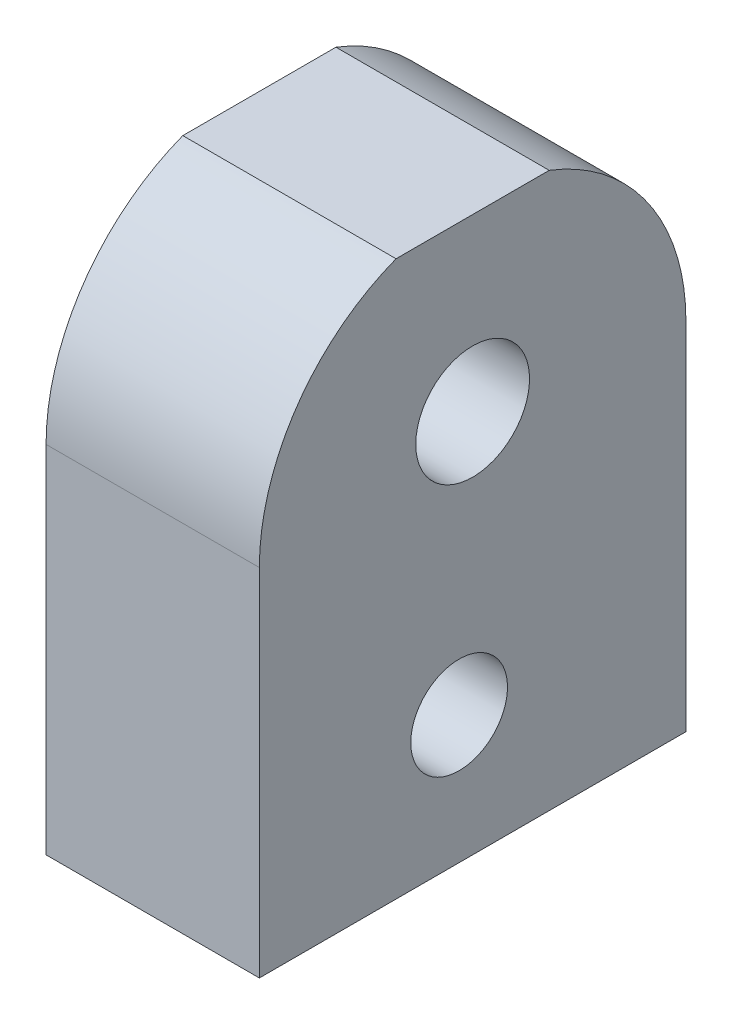
ISO-10303-21;
HEADER;
FILE_DESCRIPTION(('STEP AP214'),'2;1');
FILE_NAME('part.step','',(''),(''),'','','');
FILE_SCHEMA(('AUTOMOTIVE_DESIGN { 1 0 10303 214 1 1 1 1 }'));
ENDSEC;
DATA;
#1=APPLICATION_CONTEXT('core data for automotive mechanical design processes');
#2=APPLICATION_PROTOCOL_DEFINITION('international standard','automotive_design',2000,#1);
#3=PRODUCT_CONTEXT('',#1,'mechanical');
#4=PRODUCT('Part','Part','',(#3));
#5=PRODUCT_RELATED_PRODUCT_CATEGORY('part','',(#4));
#6=PRODUCT_DEFINITION_FORMATION('','',#4);
#7=PRODUCT_DEFINITION_CONTEXT('part definition',#1,'design');
#8=PRODUCT_DEFINITION('design','',#6,#7);
#9=PRODUCT_DEFINITION_SHAPE('','',#8);
#10=(LENGTH_UNIT() NAMED_UNIT(*) SI_UNIT(.MILLI.,.METRE.));
#11=(NAMED_UNIT(*) PLANE_ANGLE_UNIT() SI_UNIT($,.RADIAN.));
#12=(NAMED_UNIT(*) SI_UNIT($,.STERADIAN.) SOLID_ANGLE_UNIT());
#13=UNCERTAINTY_MEASURE_WITH_UNIT(LENGTH_MEASURE(1.E-05),#10,'distance_accuracy_value','');
#14=(GEOMETRIC_REPRESENTATION_CONTEXT(3) GLOBAL_UNCERTAINTY_ASSIGNED_CONTEXT((#13)) GLOBAL_UNIT_ASSIGNED_CONTEXT((#10,
#11,#12)) REPRESENTATION_CONTEXT('',''));
#15=CARTESIAN_POINT('',(0.,0.,0.));
#16=DIRECTION('',(0.,0.,1.));
#17=DIRECTION('',(1.,0.,0.));
#18=AXIS2_PLACEMENT_3D('',#15,#16,#17);
#19=CARTESIAN_POINT('',(15.,25.,15.));
#20=DIRECTION('',(-1.,0.,0.));
#21=DIRECTION('',(0.,0.,1.));
#22=AXIS2_PLACEMENT_3D('',#19,#20,#21);
#23=CYLINDRICAL_SURFACE('',#22,15.);
#24=DIRECTION('',(-1.,0.,0.));
#25=VECTOR('',#24,1.);
#26=CARTESIAN_POINT('',(15.,39.,20.3851648071345));
#27=LINE('',#26,#25);
#28=CARTESIAN_POINT('',(15.,39.,20.3851648071345));
#29=VERTEX_POINT('',#28);
#30=CARTESIAN_POINT('',(0.,39.,20.3851648071345));
#31=VERTEX_POINT('',#30);
#32=EDGE_CURVE('E80',#29,#31,#27,.T.);
#33=ORIENTED_EDGE('',*,*,#32,.T.);
#34=CARTESIAN_POINT('',(0.,25.,15.));
#35=DIRECTION('',(-1.,0.,0.));
#36=DIRECTION('',(0.,0.,1.));
#37=AXIS2_PLACEMENT_3D('',#34,#35,#36);
#38=CIRCLE('',#37,15.);
#39=CARTESIAN_POINT('',(0.,25.,30.));
#40=VERTEX_POINT('',#39);
#41=EDGE_CURVE('E154',#40,#31,#38,.T.);
#42=ORIENTED_EDGE('',*,*,#41,.F.);
#43=DIRECTION('',(1.,0.,0.));
#44=VECTOR('',#43,1.);
#45=CARTESIAN_POINT('',(15.,25.,30.));
#46=LINE('',#45,#44);
#47=CARTESIAN_POINT('',(15.,25.,30.));
#48=VERTEX_POINT('',#47);
#49=EDGE_CURVE('E124',#40,#48,#46,.T.);
#50=ORIENTED_EDGE('',*,*,#49,.T.);
#51=CARTESIAN_POINT('',(15.,25.,15.));
#52=DIRECTION('',(-1.,0.,0.));
#53=DIRECTION('',(0.,0.,1.));
#54=AXIS2_PLACEMENT_3D('',#51,#52,#53);
#55=CIRCLE('',#54,15.);
#56=EDGE_CURVE('E129',#48,#29,#55,.T.);
#57=ORIENTED_EDGE('',*,*,#56,.T.);
#58=EDGE_LOOP('',(#33,#42,#50,#57));
#59=FACE_BOUND('',#58,.T.);
#60=ADVANCED_FACE('F45',(#59),#23,.T.);
#61=CARTESIAN_POINT('',(0.,25.,0.));
#62=DIRECTION('',(0.,0.,1.));
#63=DIRECTION('',(1.,0.,0.));
#64=AXIS2_PLACEMENT_3D('',#61,#62,#63);
#65=PLANE('',#64);
#66=DIRECTION('',(-1.,0.,0.));
#67=VECTOR('',#66,1.);
#68=CARTESIAN_POINT('',(0.,0.,0.));
#69=LINE('',#68,#67);
#70=CARTESIAN_POINT('',(15.,0.,0.));
#71=VERTEX_POINT('',#70);
#72=CARTESIAN_POINT('',(0.,0.,0.));
#73=VERTEX_POINT('',#72);
#74=EDGE_CURVE('E121',#71,#73,#69,.T.);
#75=ORIENTED_EDGE('',*,*,#74,.T.);
#76=DIRECTION('',(0.,-1.,0.));
#77=VECTOR('',#76,1.);
#78=CARTESIAN_POINT('',(0.,25.,0.));
#79=LINE('',#78,#77);
#80=CARTESIAN_POINT('',(0.,25.,0.));
#81=VERTEX_POINT('',#80);
#82=EDGE_CURVE('E11',#81,#73,#79,.T.);
#83=ORIENTED_EDGE('',*,*,#82,.F.);
#84=DIRECTION('',(-1.,0.,0.));
#85=VECTOR('',#84,1.);
#86=CARTESIAN_POINT('',(0.,25.,0.));
#87=LINE('',#86,#85);
#88=CARTESIAN_POINT('',(15.,25.,0.));
#89=VERTEX_POINT('',#88);
#90=EDGE_CURVE('E116',#89,#81,#87,.T.);
#91=ORIENTED_EDGE('',*,*,#90,.F.);
#92=DIRECTION('',(0.,-1.,0.));
#93=VECTOR('',#92,1.);
#94=CARTESIAN_POINT('',(15.,25.,0.));
#95=LINE('',#94,#93);
#96=EDGE_CURVE('E109',#89,#71,#95,.T.);
#97=ORIENTED_EDGE('',*,*,#96,.T.);
#98=EDGE_LOOP('',(#75,#83,#91,#97));
#99=FACE_BOUND('',#98,.T.);
#100=ADVANCED_FACE('F47',(#99),#65,.F.);
#101=CARTESIAN_POINT('',(0.,25.,0.));
#102=DIRECTION('',(1.,0.,0.));
#103=DIRECTION('',(0.,0.,-1.));
#104=AXIS2_PLACEMENT_3D('',#101,#102,#103);
#105=PLANE('',#104);
#106=CARTESIAN_POINT('',(0.,9.,15.95));
#107=DIRECTION('',(-1.,0.,0.));
#108=DIRECTION('',(0.,0.,1.));
#109=AXIS2_PLACEMENT_3D('',#106,#107,#108);
#110=CIRCLE('',#109,3.4);
#111=CARTESIAN_POINT('',(0.,9.,19.35));
#112=VERTEX_POINT('',#111);
#113=EDGE_CURVE('E172',#112,#112,#110,.T.);
#114=ORIENTED_EDGE('',*,*,#113,.F.);
#115=EDGE_LOOP('',(#114));
#116=FACE_BOUND('',#115,.T.);
#117=CARTESIAN_POINT('',(0.,27.,15.));
#118=DIRECTION('',(-1.,0.,0.));
#119=DIRECTION('',(0.,0.,1.));
#120=AXIS2_PLACEMENT_3D('',#117,#118,#119);
#121=CIRCLE('',#120,6.1);
#122=CARTESIAN_POINT('',(0.,27.,21.1));
#123=VERTEX_POINT('',#122);
#124=EDGE_CURVE('E193',#123,#123,#121,.T.);
#125=ORIENTED_EDGE('',*,*,#124,.F.);
#126=EDGE_LOOP('',(#125));
#127=FACE_BOUND('',#126,.T.);
#128=ORIENTED_EDGE('',*,*,#41,.T.);
#129=DIRECTION('',(0.,0.,-1.));
#130=VECTOR('',#129,1.);
#131=CARTESIAN_POINT('',(0.,39.,0.));
#132=LINE('',#131,#130);
#133=CARTESIAN_POINT('',(0.,39.,9.6148351928655));
#134=VERTEX_POINT('',#133);
#135=EDGE_CURVE('E49',#134,#31,#132,.F.);
#136=ORIENTED_EDGE('',*,*,#135,.F.);
#137=EDGE_CURVE('E157',#134,#81,#38,.T.);
#138=ORIENTED_EDGE('',*,*,#137,.T.);
#139=ORIENTED_EDGE('',*,*,#82,.T.);
#140=DIRECTION('',(0.,0.,1.));
#141=VECTOR('',#140,1.);
#142=CARTESIAN_POINT('',(0.,0.,0.));
#143=LINE('',#142,#141);
#144=CARTESIAN_POINT('',(0.,0.,30.));
#145=VERTEX_POINT('',#144);
#146=EDGE_CURVE('E127',#73,#145,#143,.T.);
#147=ORIENTED_EDGE('',*,*,#146,.T.);
#148=DIRECTION('',(0.,-1.,0.));
#149=VECTOR('',#148,1.);
#150=CARTESIAN_POINT('',(0.,25.,30.));
#151=LINE('',#150,#149);
#152=EDGE_CURVE('E56',#40,#145,#151,.T.);
#153=ORIENTED_EDGE('',*,*,#152,.F.);
#154=EDGE_LOOP('',(#128,#136,#138,#139,#147,#153));
#155=FACE_BOUND('',#154,.T.);
#156=ADVANCED_FACE('F153',(#116,#127,#155),#105,.F.);
#157=CARTESIAN_POINT('',(15.,25.,30.));
#158=DIRECTION('',(0.,0.,-1.));
#159=DIRECTION('',(-1.,0.,0.));
#160=AXIS2_PLACEMENT_3D('',#157,#158,#159);
#161=PLANE('',#160);
#162=DIRECTION('',(1.,0.,0.));
#163=VECTOR('',#162,1.);
#164=CARTESIAN_POINT('',(15.,0.,30.));
#165=LINE('',#164,#163);
#166=CARTESIAN_POINT('',(15.,0.,30.));
#167=VERTEX_POINT('',#166);
#168=EDGE_CURVE('E99',#145,#167,#165,.T.);
#169=ORIENTED_EDGE('',*,*,#168,.T.);
#170=DIRECTION('',(0.,-1.,0.));
#171=VECTOR('',#170,1.);
#172=CARTESIAN_POINT('',(15.,25.,30.));
#173=LINE('',#172,#171);
#174=EDGE_CURVE('E112',#48,#167,#173,.T.);
#175=ORIENTED_EDGE('',*,*,#174,.F.);
#176=ORIENTED_EDGE('',*,*,#49,.F.);
#177=ORIENTED_EDGE('',*,*,#152,.T.);
#178=EDGE_LOOP('',(#169,#175,#176,#177));
#179=FACE_BOUND('',#178,.T.);
#180=ADVANCED_FACE('F148',(#179),#161,.F.);
#181=CARTESIAN_POINT('',(15.,25.,0.));
#182=DIRECTION('',(-1.,0.,0.));
#183=DIRECTION('',(0.,0.,1.));
#184=AXIS2_PLACEMENT_3D('',#181,#182,#183);
#185=PLANE('',#184);
#186=CARTESIAN_POINT('',(15.,9.,15.95));
#187=DIRECTION('',(-1.,0.,0.));
#188=DIRECTION('',(0.,0.,1.));
#189=AXIS2_PLACEMENT_3D('',#186,#187,#188);
#190=CIRCLE('',#189,3.4);
#191=CARTESIAN_POINT('',(15.,9.,19.35));
#192=VERTEX_POINT('',#191);
#193=EDGE_CURVE('E169',#192,#192,#190,.T.);
#194=ORIENTED_EDGE('',*,*,#193,.T.);
#195=EDGE_LOOP('',(#194));
#196=FACE_BOUND('',#195,.T.);
#197=CARTESIAN_POINT('',(15.,27.,15.));
#198=DIRECTION('',(-1.,0.,0.));
#199=DIRECTION('',(0.,0.,1.));
#200=AXIS2_PLACEMENT_3D('',#197,#198,#199);
#201=CIRCLE('',#200,4.);
#202=CARTESIAN_POINT('',(15.,27.,19.));
#203=VERTEX_POINT('',#202);
#204=EDGE_CURVE('E189',#203,#203,#201,.T.);
#205=ORIENTED_EDGE('',*,*,#204,.T.);
#206=EDGE_LOOP('',(#205));
#207=FACE_BOUND('',#206,.T.);
#208=CARTESIAN_POINT('',(15.,39.,9.6148351928655));
#209=VERTEX_POINT('',#208);
#210=EDGE_CURVE('E137',#209,#89,#55,.T.);
#211=ORIENTED_EDGE('',*,*,#210,.F.);
#212=DIRECTION('',(0.,0.,1.));
#213=VECTOR('',#212,1.);
#214=CARTESIAN_POINT('',(15.,39.,0.));
#215=LINE('',#214,#213);
#216=EDGE_CURVE('E64',#209,#29,#215,.T.);
#217=ORIENTED_EDGE('',*,*,#216,.T.);
#218=ORIENTED_EDGE('',*,*,#56,.F.);
#219=ORIENTED_EDGE('',*,*,#174,.T.);
#220=DIRECTION('',(0.,0.,-1.));
#221=VECTOR('',#220,1.);
#222=CARTESIAN_POINT('',(15.,0.,0.));
#223=LINE('',#222,#221);
#224=EDGE_CURVE('E105',#167,#71,#223,.T.);
#225=ORIENTED_EDGE('',*,*,#224,.T.);
#226=ORIENTED_EDGE('',*,*,#96,.F.);
#227=EDGE_LOOP('',(#211,#217,#218,#219,#225,#226));
#228=FACE_BOUND('',#227,.T.);
#229=ADVANCED_FACE('F108',(#196,#207,#228),#185,.F.);
#230=CARTESIAN_POINT('',(0.,0.,0.));
#231=DIRECTION('',(0.,-1.,0.));
#232=DIRECTION('',(0.,0.,-1.));
#233=AXIS2_PLACEMENT_3D('',#230,#231,#232);
#234=PLANE('',#233);
#235=CARTESIAN_POINT('',(7.5,0.,24.));
#236=DIRECTION('',(0.,-1.,0.));
#237=DIRECTION('',(0.,0.,-1.));
#238=AXIS2_PLACEMENT_3D('',#235,#236,#237);
#239=CIRCLE('',#238,1.65);
#240=CARTESIAN_POINT('',(7.5,0.,22.35));
#241=VERTEX_POINT('',#240);
#242=EDGE_CURVE('E179',#241,#241,#239,.T.);
#243=ORIENTED_EDGE('',*,*,#242,.F.);
#244=EDGE_LOOP('',(#243));
#245=FACE_BOUND('',#244,.T.);
#246=CARTESIAN_POINT('',(7.50000000000001,0.,6.));
#247=DIRECTION('',(0.,-1.,0.));
#248=DIRECTION('',(0.,0.,-1.));
#249=AXIS2_PLACEMENT_3D('',#246,#247,#248);
#250=CIRCLE('',#249,1.65);
#251=CARTESIAN_POINT('',(7.50000000000001,0.,4.35));
#252=VERTEX_POINT('',#251);
#253=EDGE_CURVE('E201',#252,#252,#250,.T.);
#254=ORIENTED_EDGE('',*,*,#253,.F.);
#255=EDGE_LOOP('',(#254));
#256=FACE_BOUND('',#255,.T.);
#257=ORIENTED_EDGE('',*,*,#74,.F.);
#258=ORIENTED_EDGE('',*,*,#224,.F.);
#259=ORIENTED_EDGE('',*,*,#168,.F.);
#260=ORIENTED_EDGE('',*,*,#146,.F.);
#261=EDGE_LOOP('',(#257,#258,#259,#260));
#262=FACE_BOUND('',#261,.T.);
#263=ADVANCED_FACE('F126',(#245,#256,#262),#234,.T.);
#264=DIRECTION('',(-1.,0.,0.));
#265=VECTOR('',#264,1.);
#266=CARTESIAN_POINT('',(15.,39.,9.6148351928655));
#267=LINE('',#266,#265);
#268=EDGE_CURVE('E75',#209,#134,#267,.T.);
#269=ORIENTED_EDGE('',*,*,#268,.F.);
#270=ORIENTED_EDGE('',*,*,#210,.T.);
#271=ORIENTED_EDGE('',*,*,#90,.T.);
#272=ORIENTED_EDGE('',*,*,#137,.F.);
#273=EDGE_LOOP('',(#269,#270,#271,#272));
#274=FACE_BOUND('',#273,.T.);
#275=ADVANCED_FACE('F215',(#274),#23,.T.);
#276=CARTESIAN_POINT('',(7.50000000000001,10.,6.));
#277=DIRECTION('',(0.,-1.,0.));
#278=DIRECTION('',(0.,0.,-1.));
#279=AXIS2_PLACEMENT_3D('',#276,#277,#278);
#280=CYLINDRICAL_SURFACE('',#279,1.65);
#281=CARTESIAN_POINT('',(7.50000000000001,10.,6.));
#282=DIRECTION('',(0.,-1.,0.));
#283=DIRECTION('',(0.,0.,-1.));
#284=AXIS2_PLACEMENT_3D('',#281,#282,#283);
#285=CIRCLE('',#284,1.65);
#286=CARTESIAN_POINT('',(7.50000000000001,10.,4.35));
#287=VERTEX_POINT('',#286);
#288=EDGE_CURVE('E182',#287,#287,#285,.T.);
#289=ORIENTED_EDGE('',*,*,#288,.F.);
#290=EDGE_LOOP('',(#289));
#291=FACE_BOUND('',#290,.T.);
#292=ORIENTED_EDGE('',*,*,#253,.T.);
#293=EDGE_LOOP('',(#292));
#294=FACE_BOUND('',#293,.T.);
#295=ADVANCED_FACE('F212',(#291,#294),#280,.F.);
#296=CARTESIAN_POINT('',(0.,10.,0.));
#297=DIRECTION('',(0.,-1.,0.));
#298=DIRECTION('',(0.,0.,-1.));
#299=AXIS2_PLACEMENT_3D('',#296,#297,#298);
#300=PLANE('',#299);
#301=ORIENTED_EDGE('',*,*,#288,.T.);
#302=EDGE_LOOP('',(#301));
#303=FACE_BOUND('',#302,.T.);
#304=ADVANCED_FACE('F231',(#303),#300,.T.);
#305=CARTESIAN_POINT('',(7.5,10.,24.));
#306=DIRECTION('',(0.,-1.,0.));
#307=DIRECTION('',(0.,0.,-1.));
#308=AXIS2_PLACEMENT_3D('',#305,#306,#307);
#309=CYLINDRICAL_SURFACE('',#308,1.65);
#310=CARTESIAN_POINT('',(7.5,10.,24.));
#311=DIRECTION('',(0.,-1.,0.));
#312=DIRECTION('',(0.,0.,-1.));
#313=AXIS2_PLACEMENT_3D('',#310,#311,#312);
#314=CIRCLE('',#313,1.65);
#315=CARTESIAN_POINT('',(7.5,10.,22.35));
#316=VERTEX_POINT('',#315);
#317=EDGE_CURVE('E162',#316,#316,#314,.T.);
#318=ORIENTED_EDGE('',*,*,#317,.F.);
#319=EDGE_LOOP('',(#318));
#320=FACE_BOUND('',#319,.T.);
#321=ORIENTED_EDGE('',*,*,#242,.T.);
#322=EDGE_LOOP('',(#321));
#323=FACE_BOUND('',#322,.T.);
#324=ADVANCED_FACE('F235',(#320,#323),#309,.F.);
#325=CARTESIAN_POINT('',(0.,10.,0.));
#326=DIRECTION('',(0.,-1.,0.));
#327=DIRECTION('',(0.,0.,-1.));
#328=AXIS2_PLACEMENT_3D('',#325,#326,#327);
#329=PLANE('',#328);
#330=ORIENTED_EDGE('',*,*,#317,.T.);
#331=EDGE_LOOP('',(#330));
#332=FACE_BOUND('',#331,.T.);
#333=ADVANCED_FACE('F239',(#332),#329,.T.);
#334=CARTESIAN_POINT('',(6.,27.,15.));
#335=DIRECTION('',(-1.,0.,0.));
#336=DIRECTION('',(0.,0.,1.));
#337=AXIS2_PLACEMENT_3D('',#334,#335,#336);
#338=CYLINDRICAL_SURFACE('',#337,6.1);
#339=CARTESIAN_POINT('',(6.,27.,15.));
#340=DIRECTION('',(-1.,0.,0.));
#341=DIRECTION('',(0.,0.,1.));
#342=AXIS2_PLACEMENT_3D('',#339,#340,#341);
#343=CIRCLE('',#342,6.1);
#344=CARTESIAN_POINT('',(6.,27.,21.1));
#345=VERTEX_POINT('',#344);
#346=EDGE_CURVE('E197',#345,#345,#343,.T.);
#347=ORIENTED_EDGE('',*,*,#346,.F.);
#348=EDGE_LOOP('',(#347));
#349=FACE_BOUND('',#348,.T.);
#350=ORIENTED_EDGE('',*,*,#124,.T.);
#351=EDGE_LOOP('',(#350));
#352=FACE_BOUND('',#351,.T.);
#353=ADVANCED_FACE('F243',(#349,#352),#338,.F.);
#354=CARTESIAN_POINT('',(6.,27.,15.));
#355=DIRECTION('',(-1.,0.,0.));
#356=DIRECTION('',(0.,0.,1.));
#357=AXIS2_PLACEMENT_3D('',#354,#355,#356);
#358=PLANE('',#357);
#359=CARTESIAN_POINT('',(6.,27.,15.));
#360=DIRECTION('',(-1.,0.,0.));
#361=DIRECTION('',(0.,0.,1.));
#362=AXIS2_PLACEMENT_3D('',#359,#360,#361);
#363=CIRCLE('',#362,4.);
#364=CARTESIAN_POINT('',(6.,27.,19.));
#365=VERTEX_POINT('',#364);
#366=EDGE_CURVE('E174',#365,#365,#363,.T.);
#367=ORIENTED_EDGE('',*,*,#366,.F.);
#368=EDGE_LOOP('',(#367));
#369=FACE_BOUND('',#368,.T.);
#370=ORIENTED_EDGE('',*,*,#346,.T.);
#371=EDGE_LOOP('',(#370));
#372=FACE_BOUND('',#371,.T.);
#373=ADVANCED_FACE('F247',(#369,#372),#358,.T.);
#374=CARTESIAN_POINT('',(15.,27.,15.));
#375=DIRECTION('',(-1.,0.,0.));
#376=DIRECTION('',(0.,0.,1.));
#377=AXIS2_PLACEMENT_3D('',#374,#375,#376);
#378=CYLINDRICAL_SURFACE('',#377,4.);
#379=ORIENTED_EDGE('',*,*,#204,.F.);
#380=EDGE_LOOP('',(#379));
#381=FACE_BOUND('',#380,.T.);
#382=ORIENTED_EDGE('',*,*,#366,.T.);
#383=EDGE_LOOP('',(#382));
#384=FACE_BOUND('',#383,.T.);
#385=ADVANCED_FACE('F251',(#381,#384),#378,.F.);
#386=CARTESIAN_POINT('',(15.,39.,0.));
#387=DIRECTION('',(0.,-1.,0.));
#388=DIRECTION('',(0.,0.,-1.));
#389=AXIS2_PLACEMENT_3D('',#386,#387,#388);
#390=PLANE('',#389);
#391=ORIENTED_EDGE('',*,*,#32,.F.);
#392=ORIENTED_EDGE('',*,*,#216,.F.);
#393=ORIENTED_EDGE('',*,*,#268,.T.);
#394=ORIENTED_EDGE('',*,*,#135,.T.);
#395=EDGE_LOOP('',(#391,#392,#393,#394));
#396=FACE_BOUND('',#395,.T.);
#397=ADVANCED_FACE('F255',(#396),#390,.F.);
#398=CARTESIAN_POINT('',(15.,9.,15.95));
#399=DIRECTION('',(-1.,0.,0.));
#400=DIRECTION('',(0.,0.,1.));
#401=AXIS2_PLACEMENT_3D('',#398,#399,#400);
#402=CYLINDRICAL_SURFACE('',#401,3.4);
#403=ORIENTED_EDGE('',*,*,#193,.F.);
#404=EDGE_LOOP('',(#403));
#405=FACE_BOUND('',#404,.T.);
#406=ORIENTED_EDGE('',*,*,#113,.T.);
#407=EDGE_LOOP('',(#406));
#408=FACE_BOUND('',#407,.T.);
#409=ADVANCED_FACE('F259',(#405,#408),#402,.F.);
#410=CLOSED_SHELL('',(#60,#100,#156,#180,#229,#263,#275,#295,#304,#324,#333,#353,#373,#385,#397,#409));
#411=MANIFOLD_SOLID_BREP('B2',#410);
#412=ADVANCED_BREP_SHAPE_REPRESENTATION('',(#18,#411),#14);
#413=SHAPE_DEFINITION_REPRESENTATION(#9,#412);
ENDSEC;
END-ISO-10303-21;
